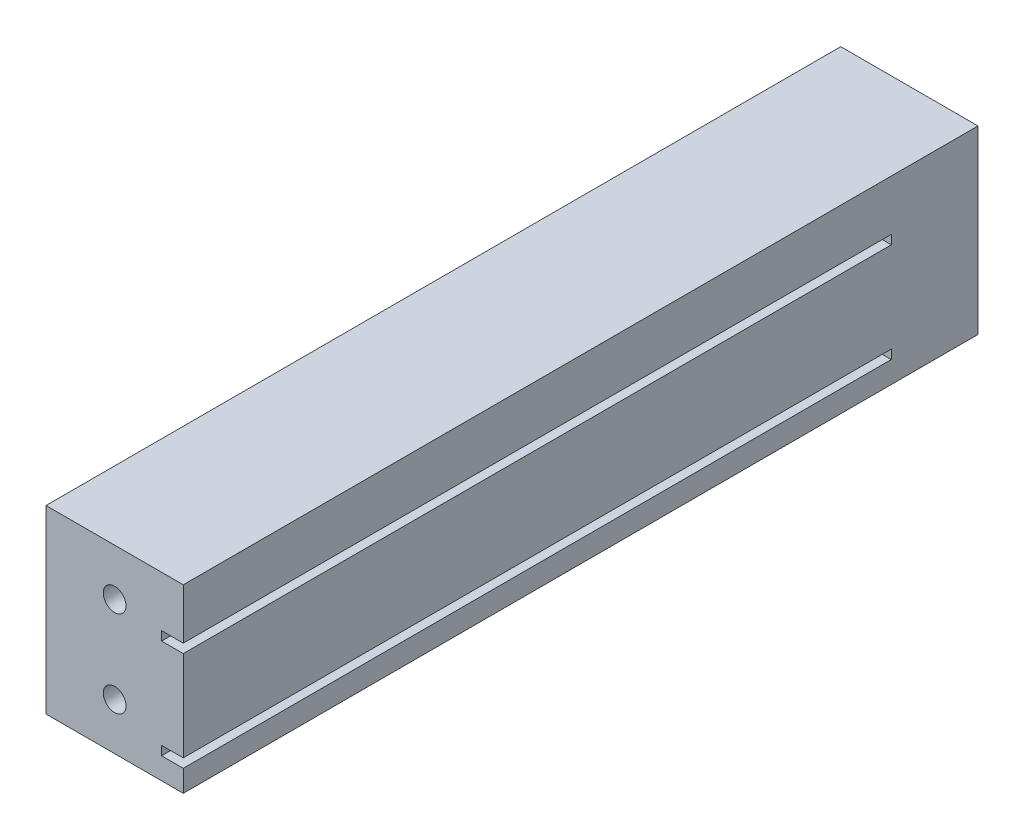
ISO-10303-21;
HEADER;
FILE_DESCRIPTION(('STEP AP214'),'2;1');
FILE_NAME('part.step','',(''),(''),'','','');
FILE_SCHEMA(('AUTOMOTIVE_DESIGN { 1 0 10303 214 1 1 1 1 }'));
ENDSEC;
DATA;
#1=APPLICATION_CONTEXT('core data for automotive mechanical design processes');
#2=APPLICATION_PROTOCOL_DEFINITION('international standard','automotive_design',2000,#1);
#3=PRODUCT_CONTEXT('',#1,'mechanical');
#4=PRODUCT('Part','Part','',(#3));
#5=PRODUCT_RELATED_PRODUCT_CATEGORY('part','',(#4));
#6=PRODUCT_DEFINITION_FORMATION('','',#4);
#7=PRODUCT_DEFINITION_CONTEXT('part definition',#1,'design');
#8=PRODUCT_DEFINITION('design','',#6,#7);
#9=PRODUCT_DEFINITION_SHAPE('','',#8);
#10=(LENGTH_UNIT() NAMED_UNIT(*) SI_UNIT(.MILLI.,.METRE.));
#11=(NAMED_UNIT(*) PLANE_ANGLE_UNIT() SI_UNIT($,.RADIAN.));
#12=(NAMED_UNIT(*) SI_UNIT($,.STERADIAN.) SOLID_ANGLE_UNIT());
#13=UNCERTAINTY_MEASURE_WITH_UNIT(LENGTH_MEASURE(1.E-05),#10,'distance_accuracy_value','');
#14=(GEOMETRIC_REPRESENTATION_CONTEXT(3) GLOBAL_UNCERTAINTY_ASSIGNED_CONTEXT((#13)) GLOBAL_UNIT_ASSIGNED_CONTEXT((#10,
#11,#12)) REPRESENTATION_CONTEXT('',''));
#15=CARTESIAN_POINT('',(0.,0.,0.));
#16=DIRECTION('',(0.,0.,1.));
#17=DIRECTION('',(1.,0.,0.));
#18=AXIS2_PLACEMENT_3D('',#15,#16,#17);
#19=CARTESIAN_POINT('',(-9.5,25.,55.));
#20=DIRECTION('',(1.,0.,0.));
#21=DIRECTION('',(0.,0.,-1.));
#22=AXIS2_PLACEMENT_3D('',#19,#20,#21);
#23=PLANE('',#22);
#24=CARTESIAN_POINT('',(-9.5,6.,51.));
#25=DIRECTION('',(-1.,0.,0.));
#26=DIRECTION('',(0.,0.,1.));
#27=AXIS2_PLACEMENT_3D('',#24,#25,#26);
#28=CIRCLE('',#27,1.5);
#29=CARTESIAN_POINT('',(-9.5,6.,52.5));
#30=VERTEX_POINT('',#29);
#31=EDGE_CURVE('E144',#30,#30,#28,.T.);
#32=ORIENTED_EDGE('',*,*,#31,.F.);
#33=EDGE_LOOP('',(#32));
#34=FACE_BOUND('',#33,.T.);
#35=CARTESIAN_POINT('',(-9.5,6.,-50.));
#36=DIRECTION('',(-1.,0.,0.));
#37=DIRECTION('',(0.,0.,1.));
#38=AXIS2_PLACEMENT_3D('',#35,#36,#37);
#39=CIRCLE('',#38,1.5);
#40=CARTESIAN_POINT('',(-9.5,6.,-48.5));
#41=VERTEX_POINT('',#40);
#42=EDGE_CURVE('E143',#41,#41,#39,.T.);
#43=ORIENTED_EDGE('',*,*,#42,.F.);
#44=EDGE_LOOP('',(#43));
#45=FACE_BOUND('',#44,.T.);
#46=DIRECTION('',(0.,0.,1.));
#47=VECTOR('',#46,1.);
#48=CARTESIAN_POINT('',(-9.5,0.,55.));
#49=LINE('',#48,#47);
#50=CARTESIAN_POINT('',(-9.5,0.,-55.));
#51=VERTEX_POINT('',#50);
#52=CARTESIAN_POINT('',(-9.5,0.,55.));
#53=VERTEX_POINT('',#52);
#54=EDGE_CURVE('E209',#51,#53,#49,.T.);
#55=ORIENTED_EDGE('',*,*,#54,.T.);
#56=DIRECTION('',(0.,-1.,0.));
#57=VECTOR('',#56,1.);
#58=CARTESIAN_POINT('',(-9.5,25.,55.));
#59=LINE('',#58,#57);
#60=CARTESIAN_POINT('',(-9.5,25.,55.));
#61=VERTEX_POINT('',#60);
#62=EDGE_CURVE('E47',#61,#53,#59,.T.);
#63=ORIENTED_EDGE('',*,*,#62,.F.);
#64=DIRECTION('',(0.,0.,1.));
#65=VECTOR('',#64,1.);
#66=CARTESIAN_POINT('',(-9.5,25.,55.));
#67=LINE('',#66,#65);
#68=CARTESIAN_POINT('',(-9.5,25.,-55.));
#69=VERTEX_POINT('',#68);
#70=EDGE_CURVE('E215',#69,#61,#67,.T.);
#71=ORIENTED_EDGE('',*,*,#70,.F.);
#72=DIRECTION('',(0.,-1.,0.));
#73=VECTOR('',#72,1.);
#74=CARTESIAN_POINT('',(-9.5,25.,-55.));
#75=LINE('',#74,#73);
#76=EDGE_CURVE('E225',#69,#51,#75,.T.);
#77=ORIENTED_EDGE('',*,*,#76,.T.);
#78=EDGE_LOOP('',(#55,#63,#71,#77));
#79=FACE_BOUND('',#78,.T.);
#80=ADVANCED_FACE('F35',(#34,#45,#79),#23,.F.);
#81=CARTESIAN_POINT('',(9.5,25.,55.));
#82=DIRECTION('',(0.,0.,-1.));
#83=DIRECTION('',(-1.,0.,0.));
#84=AXIS2_PLACEMENT_3D('',#81,#82,#83);
#85=PLANE('',#84);
#86=CARTESIAN_POINT('',(0.,6.5,55.));
#87=DIRECTION('',(0.,0.,1.));
#88=DIRECTION('',(-1.,0.,0.));
#89=AXIS2_PLACEMENT_3D('',#86,#87,#88);
#90=CIRCLE('',#89,1.575);
#91=CARTESIAN_POINT('',(-1.575,6.5,55.));
#92=VERTEX_POINT('',#91);
#93=EDGE_CURVE('E482',#92,#92,#90,.T.);
#94=ORIENTED_EDGE('',*,*,#93,.F.);
#95=EDGE_LOOP('',(#94));
#96=FACE_BOUND('',#95,.T.);
#97=CARTESIAN_POINT('',(0.,18.5,55.));
#98=DIRECTION('',(0.,0.,1.));
#99=DIRECTION('',(1.,0.,0.));
#100=AXIS2_PLACEMENT_3D('',#97,#98,#99);
#101=CIRCLE('',#100,1.575);
#102=CARTESIAN_POINT('',(1.575,18.5,55.));
#103=VERTEX_POINT('',#102);
#104=EDGE_CURVE('E139',#103,#103,#101,.T.);
#105=ORIENTED_EDGE('',*,*,#104,.F.);
#106=EDGE_LOOP('',(#105));
#107=FACE_BOUND('',#106,.T.);
#108=DIRECTION('',(0.,-1.,0.));
#109=VECTOR('',#108,1.);
#110=CARTESIAN_POINT('',(6.5,18.,55.));
#111=LINE('',#110,#109);
#112=CARTESIAN_POINT('',(6.5,18.,55.));
#113=VERTEX_POINT('',#112);
#114=CARTESIAN_POINT('',(6.5,16.75,55.));
#115=VERTEX_POINT('',#114);
#116=EDGE_CURVE('E158',#113,#115,#111,.T.);
#117=ORIENTED_EDGE('',*,*,#116,.F.);
#118=DIRECTION('',(1.,0.,0.));
#119=VECTOR('',#118,1.);
#120=CARTESIAN_POINT('',(6.5,18.,55.));
#121=LINE('',#120,#119);
#122=CARTESIAN_POINT('',(9.5,18.,55.));
#123=VERTEX_POINT('',#122);
#124=EDGE_CURVE('E176',#113,#123,#121,.T.);
#125=ORIENTED_EDGE('',*,*,#124,.T.);
#126=DIRECTION('',(0.,-1.,0.));
#127=VECTOR('',#126,1.);
#128=CARTESIAN_POINT('',(9.5,25.,55.));
#129=LINE('',#128,#127);
#130=CARTESIAN_POINT('',(9.5,25.,55.));
#131=VERTEX_POINT('',#130);
#132=EDGE_CURVE('E240',#131,#123,#129,.T.);
#133=ORIENTED_EDGE('',*,*,#132,.F.);
#134=DIRECTION('',(1.,0.,0.));
#135=VECTOR('',#134,1.);
#136=CARTESIAN_POINT('',(9.5,25.,55.));
#137=LINE('',#136,#135);
#138=EDGE_CURVE('E218',#61,#131,#137,.T.);
#139=ORIENTED_EDGE('',*,*,#138,.F.);
#140=ORIENTED_EDGE('',*,*,#62,.T.);
#141=DIRECTION('',(1.,0.,0.));
#142=VECTOR('',#141,1.);
#143=CARTESIAN_POINT('',(9.5,0.,55.));
#144=LINE('',#143,#142);
#145=CARTESIAN_POINT('',(9.5,0.,55.));
#146=VERTEX_POINT('',#145);
#147=EDGE_CURVE('E228',#53,#146,#144,.T.);
#148=ORIENTED_EDGE('',*,*,#147,.T.);
#149=CARTESIAN_POINT('',(9.5,3.,55.));
#150=VERTEX_POINT('',#149);
#151=EDGE_CURVE('E239',#150,#146,#129,.T.);
#152=ORIENTED_EDGE('',*,*,#151,.F.);
#153=DIRECTION('',(1.,0.,0.));
#154=VECTOR('',#153,1.);
#155=CARTESIAN_POINT('',(6.5,3.,55.));
#156=LINE('',#155,#154);
#157=CARTESIAN_POINT('',(6.5,3.,55.));
#158=VERTEX_POINT('',#157);
#159=EDGE_CURVE('E198',#158,#150,#156,.T.);
#160=ORIENTED_EDGE('',*,*,#159,.F.);
#161=DIRECTION('',(0.,-1.,0.));
#162=VECTOR('',#161,1.);
#163=CARTESIAN_POINT('',(6.5,4.25,55.));
#164=LINE('',#163,#162);
#165=CARTESIAN_POINT('',(6.5,4.25,55.));
#166=VERTEX_POINT('',#165);
#167=EDGE_CURVE('E185',#166,#158,#164,.T.);
#168=ORIENTED_EDGE('',*,*,#167,.F.);
#169=DIRECTION('',(1.,0.,0.));
#170=VECTOR('',#169,1.);
#171=CARTESIAN_POINT('',(6.5,4.25,55.));
#172=LINE('',#171,#170);
#173=CARTESIAN_POINT('',(9.5,4.25,55.));
#174=VERTEX_POINT('',#173);
#175=EDGE_CURVE('E206',#166,#174,#172,.T.);
#176=ORIENTED_EDGE('',*,*,#175,.T.);
#177=CARTESIAN_POINT('',(9.5,16.75,55.));
#178=VERTEX_POINT('',#177);
#179=EDGE_CURVE('E242',#178,#174,#129,.T.);
#180=ORIENTED_EDGE('',*,*,#179,.F.);
#181=DIRECTION('',(1.,0.,0.));
#182=VECTOR('',#181,1.);
#183=CARTESIAN_POINT('',(6.5,16.75,55.));
#184=LINE('',#183,#182);
#185=EDGE_CURVE('E60',#115,#178,#184,.T.);
#186=ORIENTED_EDGE('',*,*,#185,.F.);
#187=EDGE_LOOP('',(#117,#125,#133,#139,#140,#148,#152,#160,#168,#176,#180,#186));
#188=FACE_BOUND('',#187,.T.);
#189=ADVANCED_FACE('F247',(#96,#107,#188),#85,.F.);
#190=CARTESIAN_POINT('',(9.5,25.,55.));
#191=DIRECTION('',(-1.,0.,0.));
#192=DIRECTION('',(0.,0.,1.));
#193=AXIS2_PLACEMENT_3D('',#190,#191,#192);
#194=PLANE('',#193);
#195=ORIENTED_EDGE('',*,*,#132,.T.);
#196=DIRECTION('',(0.,0.,1.));
#197=VECTOR('',#196,1.);
#198=CARTESIAN_POINT('',(9.5,18.,55.));
#199=LINE('',#198,#197);
#200=CARTESIAN_POINT('',(9.5,18.,-43.));
#201=VERTEX_POINT('',#200);
#202=EDGE_CURVE('E162',#201,#123,#199,.T.);
#203=ORIENTED_EDGE('',*,*,#202,.F.);
#204=DIRECTION('',(0.,1.,0.));
#205=VECTOR('',#204,1.);
#206=CARTESIAN_POINT('',(9.5,18.,-43.));
#207=LINE('',#206,#205);
#208=CARTESIAN_POINT('',(9.5,16.75,-43.));
#209=VERTEX_POINT('',#208);
#210=EDGE_CURVE('E172',#209,#201,#207,.T.);
#211=ORIENTED_EDGE('',*,*,#210,.F.);
#212=DIRECTION('',(0.,0.,-1.));
#213=VECTOR('',#212,1.);
#214=CARTESIAN_POINT('',(9.5,16.75,55.));
#215=LINE('',#214,#213);
#216=EDGE_CURVE('E156',#178,#209,#215,.T.);
#217=ORIENTED_EDGE('',*,*,#216,.F.);
#218=ORIENTED_EDGE('',*,*,#179,.T.);
#219=DIRECTION('',(0.,0.,1.));
#220=VECTOR('',#219,1.);
#221=CARTESIAN_POINT('',(9.5,4.25,55.));
#222=LINE('',#221,#220);
#223=CARTESIAN_POINT('',(9.5,4.25,-43.));
#224=VERTEX_POINT('',#223);
#225=EDGE_CURVE('E189',#224,#174,#222,.T.);
#226=ORIENTED_EDGE('',*,*,#225,.F.);
#227=DIRECTION('',(0.,1.,0.));
#228=VECTOR('',#227,1.);
#229=CARTESIAN_POINT('',(9.5,4.25,-43.));
#230=LINE('',#229,#228);
#231=CARTESIAN_POINT('',(9.5,3.,-43.));
#232=VERTEX_POINT('',#231);
#233=EDGE_CURVE('E201',#232,#224,#230,.T.);
#234=ORIENTED_EDGE('',*,*,#233,.F.);
#235=DIRECTION('',(0.,0.,-1.));
#236=VECTOR('',#235,1.);
#237=CARTESIAN_POINT('',(9.5,3.,55.));
#238=LINE('',#237,#236);
#239=EDGE_CURVE('E179',#150,#232,#238,.T.);
#240=ORIENTED_EDGE('',*,*,#239,.F.);
#241=ORIENTED_EDGE('',*,*,#151,.T.);
#242=DIRECTION('',(0.,0.,-1.));
#243=VECTOR('',#242,1.);
#244=CARTESIAN_POINT('',(9.5,0.,55.));
#245=LINE('',#244,#243);
#246=CARTESIAN_POINT('',(9.5,0.,-55.));
#247=VERTEX_POINT('',#246);
#248=EDGE_CURVE('E231',#146,#247,#245,.T.);
#249=ORIENTED_EDGE('',*,*,#248,.T.);
#250=DIRECTION('',(0.,-1.,0.));
#251=VECTOR('',#250,1.);
#252=CARTESIAN_POINT('',(9.5,25.,-55.));
#253=LINE('',#252,#251);
#254=CARTESIAN_POINT('',(9.5,25.,-55.));
#255=VERTEX_POINT('',#254);
#256=EDGE_CURVE('E236',#255,#247,#253,.T.);
#257=ORIENTED_EDGE('',*,*,#256,.F.);
#258=DIRECTION('',(0.,0.,-1.));
#259=VECTOR('',#258,1.);
#260=CARTESIAN_POINT('',(9.5,25.,55.));
#261=LINE('',#260,#259);
#262=EDGE_CURVE('E221',#131,#255,#261,.T.);
#263=ORIENTED_EDGE('',*,*,#262,.F.);
#264=EDGE_LOOP('',(#195,#203,#211,#217,#218,#226,#234,#240,#241,#249,#257,#263));
#265=FACE_BOUND('',#264,.T.);
#266=ADVANCED_FACE('F260',(#265),#194,.F.);
#267=CARTESIAN_POINT('',(9.5,25.,-55.));
#268=DIRECTION('',(0.,0.,1.));
#269=DIRECTION('',(1.,0.,0.));
#270=AXIS2_PLACEMENT_3D('',#267,#268,#269);
#271=PLANE('',#270);
#272=DIRECTION('',(-1.,0.,0.));
#273=VECTOR('',#272,1.);
#274=CARTESIAN_POINT('',(9.5,0.,-55.));
#275=LINE('',#274,#273);
#276=EDGE_CURVE('E219',#247,#51,#275,.T.);
#277=ORIENTED_EDGE('',*,*,#276,.T.);
#278=ORIENTED_EDGE('',*,*,#76,.F.);
#279=DIRECTION('',(-1.,0.,0.));
#280=VECTOR('',#279,1.);
#281=CARTESIAN_POINT('',(9.5,25.,-55.));
#282=LINE('',#281,#280);
#283=EDGE_CURVE('E223',#255,#69,#282,.T.);
#284=ORIENTED_EDGE('',*,*,#283,.F.);
#285=ORIENTED_EDGE('',*,*,#256,.T.);
#286=EDGE_LOOP('',(#277,#278,#284,#285));
#287=FACE_BOUND('',#286,.T.);
#288=ADVANCED_FACE('F265',(#287),#271,.F.);
#289=CARTESIAN_POINT('',(0.,25.,0.));
#290=DIRECTION('',(0.,1.,0.));
#291=DIRECTION('',(0.,0.,1.));
#292=AXIS2_PLACEMENT_3D('',#289,#290,#291);
#293=PLANE('',#292);
#294=ORIENTED_EDGE('',*,*,#70,.T.);
#295=ORIENTED_EDGE('',*,*,#138,.T.);
#296=ORIENTED_EDGE('',*,*,#262,.T.);
#297=ORIENTED_EDGE('',*,*,#283,.T.);
#298=EDGE_LOOP('',(#294,#295,#296,#297));
#299=FACE_BOUND('',#298,.T.);
#300=ADVANCED_FACE('F267',(#299),#293,.T.);
#301=CARTESIAN_POINT('',(0.,0.,0.));
#302=DIRECTION('',(0.,1.,0.));
#303=DIRECTION('',(0.,0.,1.));
#304=AXIS2_PLACEMENT_3D('',#301,#302,#303);
#305=PLANE('',#304);
#306=ORIENTED_EDGE('',*,*,#54,.F.);
#307=ORIENTED_EDGE('',*,*,#276,.F.);
#308=ORIENTED_EDGE('',*,*,#248,.F.);
#309=ORIENTED_EDGE('',*,*,#147,.F.);
#310=EDGE_LOOP('',(#306,#307,#308,#309));
#311=FACE_BOUND('',#310,.T.);
#312=ADVANCED_FACE('F257',(#311),#305,.F.);
#313=CARTESIAN_POINT('',(6.5,4.25,55.));
#314=DIRECTION('',(0.,1.,0.));
#315=DIRECTION('',(0.,0.,1.));
#316=AXIS2_PLACEMENT_3D('',#313,#314,#315);
#317=PLANE('',#316);
#318=ORIENTED_EDGE('',*,*,#225,.T.);
#319=ORIENTED_EDGE('',*,*,#175,.F.);
#320=DIRECTION('',(0.,0.,1.));
#321=VECTOR('',#320,1.);
#322=CARTESIAN_POINT('',(6.5,4.25,55.));
#323=LINE('',#322,#321);
#324=CARTESIAN_POINT('',(6.5,4.25,-43.));
#325=VERTEX_POINT('',#324);
#326=EDGE_CURVE('E195',#325,#166,#323,.T.);
#327=ORIENTED_EDGE('',*,*,#326,.F.);
#328=DIRECTION('',(1.,0.,0.));
#329=VECTOR('',#328,1.);
#330=CARTESIAN_POINT('',(6.5,4.25,-43.));
#331=LINE('',#330,#329);
#332=EDGE_CURVE('E210',#325,#224,#331,.T.);
#333=ORIENTED_EDGE('',*,*,#332,.T.);
#334=EDGE_LOOP('',(#318,#319,#327,#333));
#335=FACE_BOUND('',#334,.T.);
#336=ADVANCED_FACE('F284',(#335),#317,.F.);
#337=CARTESIAN_POINT('',(6.5,4.25,-43.));
#338=DIRECTION('',(0.,0.,-1.));
#339=DIRECTION('',(-1.,0.,0.));
#340=AXIS2_PLACEMENT_3D('',#337,#338,#339);
#341=PLANE('',#340);
#342=ORIENTED_EDGE('',*,*,#233,.T.);
#343=ORIENTED_EDGE('',*,*,#332,.F.);
#344=DIRECTION('',(0.,1.,0.));
#345=VECTOR('',#344,1.);
#346=CARTESIAN_POINT('',(6.5,4.25,-43.));
#347=LINE('',#346,#345);
#348=CARTESIAN_POINT('',(6.5,3.,-43.));
#349=VERTEX_POINT('',#348);
#350=EDGE_CURVE('E192',#349,#325,#347,.T.);
#351=ORIENTED_EDGE('',*,*,#350,.F.);
#352=DIRECTION('',(1.,0.,0.));
#353=VECTOR('',#352,1.);
#354=CARTESIAN_POINT('',(6.5,3.,-43.));
#355=LINE('',#354,#353);
#356=EDGE_CURVE('E212',#349,#232,#355,.T.);
#357=ORIENTED_EDGE('',*,*,#356,.T.);
#358=EDGE_LOOP('',(#342,#343,#351,#357));
#359=FACE_BOUND('',#358,.T.);
#360=ADVANCED_FACE('F289',(#359),#341,.F.);
#361=CARTESIAN_POINT('',(6.5,3.,55.));
#362=DIRECTION('',(0.,-1.,0.));
#363=DIRECTION('',(0.,0.,-1.));
#364=AXIS2_PLACEMENT_3D('',#361,#362,#363);
#365=PLANE('',#364);
#366=ORIENTED_EDGE('',*,*,#239,.T.);
#367=ORIENTED_EDGE('',*,*,#356,.F.);
#368=DIRECTION('',(0.,0.,-1.));
#369=VECTOR('',#368,1.);
#370=CARTESIAN_POINT('',(6.5,3.,55.));
#371=LINE('',#370,#369);
#372=EDGE_CURVE('E188',#158,#349,#371,.T.);
#373=ORIENTED_EDGE('',*,*,#372,.F.);
#374=ORIENTED_EDGE('',*,*,#159,.T.);
#375=EDGE_LOOP('',(#366,#367,#373,#374));
#376=FACE_BOUND('',#375,.T.);
#377=ADVANCED_FACE('F292',(#376),#365,.F.);
#378=CARTESIAN_POINT('',(6.5,0.,0.));
#379=DIRECTION('',(1.,0.,0.));
#380=DIRECTION('',(0.,0.,-1.));
#381=AXIS2_PLACEMENT_3D('',#378,#379,#380);
#382=PLANE('',#381);
#383=ORIENTED_EDGE('',*,*,#167,.T.);
#384=ORIENTED_EDGE('',*,*,#372,.T.);
#385=ORIENTED_EDGE('',*,*,#350,.T.);
#386=ORIENTED_EDGE('',*,*,#326,.T.);
#387=EDGE_LOOP('',(#383,#384,#385,#386));
#388=FACE_BOUND('',#387,.T.);
#389=ADVANCED_FACE('F286',(#388),#382,.T.);
#390=CARTESIAN_POINT('',(6.5,18.,55.));
#391=DIRECTION('',(0.,1.,0.));
#392=DIRECTION('',(0.,0.,1.));
#393=AXIS2_PLACEMENT_3D('',#390,#391,#392);
#394=PLANE('',#393);
#395=ORIENTED_EDGE('',*,*,#202,.T.);
#396=ORIENTED_EDGE('',*,*,#124,.F.);
#397=DIRECTION('',(0.,0.,1.));
#398=VECTOR('',#397,1.);
#399=CARTESIAN_POINT('',(6.5,18.,55.));
#400=LINE('',#399,#398);
#401=CARTESIAN_POINT('',(6.5,18.,-43.));
#402=VERTEX_POINT('',#401);
#403=EDGE_CURVE('E168',#402,#113,#400,.T.);
#404=ORIENTED_EDGE('',*,*,#403,.F.);
#405=DIRECTION('',(1.,0.,0.));
#406=VECTOR('',#405,1.);
#407=CARTESIAN_POINT('',(6.5,18.,-43.));
#408=LINE('',#407,#406);
#409=EDGE_CURVE('E180',#402,#201,#408,.T.);
#410=ORIENTED_EDGE('',*,*,#409,.T.);
#411=EDGE_LOOP('',(#395,#396,#404,#410));
#412=FACE_BOUND('',#411,.T.);
#413=ADVANCED_FACE('F272',(#412),#394,.F.);
#414=CARTESIAN_POINT('',(6.5,18.,-43.));
#415=DIRECTION('',(0.,0.,-1.));
#416=DIRECTION('',(-1.,0.,0.));
#417=AXIS2_PLACEMENT_3D('',#414,#415,#416);
#418=PLANE('',#417);
#419=ORIENTED_EDGE('',*,*,#210,.T.);
#420=ORIENTED_EDGE('',*,*,#409,.F.);
#421=DIRECTION('',(0.,1.,0.));
#422=VECTOR('',#421,1.);
#423=CARTESIAN_POINT('',(6.5,18.,-43.));
#424=LINE('',#423,#422);
#425=CARTESIAN_POINT('',(6.5,16.75,-43.));
#426=VERTEX_POINT('',#425);
#427=EDGE_CURVE('E165',#426,#402,#424,.T.);
#428=ORIENTED_EDGE('',*,*,#427,.F.);
#429=DIRECTION('',(1.,0.,0.));
#430=VECTOR('',#429,1.);
#431=CARTESIAN_POINT('',(6.5,16.75,-43.));
#432=LINE('',#431,#430);
#433=EDGE_CURVE('E182',#426,#209,#432,.T.);
#434=ORIENTED_EDGE('',*,*,#433,.T.);
#435=EDGE_LOOP('',(#419,#420,#428,#434));
#436=FACE_BOUND('',#435,.T.);
#437=ADVANCED_FACE('F277',(#436),#418,.F.);
#438=CARTESIAN_POINT('',(6.5,16.75,55.));
#439=DIRECTION('',(0.,-1.,0.));
#440=DIRECTION('',(0.,0.,-1.));
#441=AXIS2_PLACEMENT_3D('',#438,#439,#440);
#442=PLANE('',#441);
#443=ORIENTED_EDGE('',*,*,#216,.T.);
#444=ORIENTED_EDGE('',*,*,#433,.F.);
#445=DIRECTION('',(0.,0.,-1.));
#446=VECTOR('',#445,1.);
#447=CARTESIAN_POINT('',(6.5,16.75,55.));
#448=LINE('',#447,#446);
#449=EDGE_CURVE('E161',#115,#426,#448,.T.);
#450=ORIENTED_EDGE('',*,*,#449,.F.);
#451=ORIENTED_EDGE('',*,*,#185,.T.);
#452=EDGE_LOOP('',(#443,#444,#450,#451));
#453=FACE_BOUND('',#452,.T.);
#454=ADVANCED_FACE('F323',(#453),#442,.F.);
#455=CARTESIAN_POINT('',(6.5,0.,0.));
#456=DIRECTION('',(1.,0.,0.));
#457=DIRECTION('',(0.,0.,-1.));
#458=AXIS2_PLACEMENT_3D('',#455,#456,#457);
#459=PLANE('',#458);
#460=ORIENTED_EDGE('',*,*,#116,.T.);
#461=ORIENTED_EDGE('',*,*,#449,.T.);
#462=ORIENTED_EDGE('',*,*,#427,.T.);
#463=ORIENTED_EDGE('',*,*,#403,.T.);
#464=EDGE_LOOP('',(#460,#461,#462,#463));
#465=FACE_BOUND('',#464,.T.);
#466=ADVANCED_FACE('F274',(#465),#459,.T.);
#467=CARTESIAN_POINT('',(0.5,6.,-50.));
#468=DIRECTION('',(-1.,0.,0.));
#469=DIRECTION('',(0.,0.,1.));
#470=AXIS2_PLACEMENT_3D('',#467,#468,#469);
#471=CYLINDRICAL_SURFACE('',#470,1.5);
#472=CARTESIAN_POINT('',(0.5,6.,-50.));
#473=DIRECTION('',(-1.,0.,0.));
#474=DIRECTION('',(0.,0.,1.));
#475=AXIS2_PLACEMENT_3D('',#472,#473,#474);
#476=CIRCLE('',#475,1.5);
#477=CARTESIAN_POINT('',(0.5,6.,-48.5));
#478=VERTEX_POINT('',#477);
#479=EDGE_CURVE('E147',#478,#478,#476,.T.);
#480=ORIENTED_EDGE('',*,*,#479,.F.);
#481=EDGE_LOOP('',(#480));
#482=FACE_BOUND('',#481,.T.);
#483=ORIENTED_EDGE('',*,*,#42,.T.);
#484=EDGE_LOOP('',(#483));
#485=FACE_BOUND('',#484,.T.);
#486=ADVANCED_FACE('F312',(#482,#485),#471,.F.);
#487=CARTESIAN_POINT('',(0.5,6.,-50.));
#488=DIRECTION('',(-1.,0.,0.));
#489=DIRECTION('',(0.,0.,1.));
#490=AXIS2_PLACEMENT_3D('',#487,#488,#489);
#491=PLANE('',#490);
#492=ORIENTED_EDGE('',*,*,#479,.T.);
#493=EDGE_LOOP('',(#492));
#494=FACE_BOUND('',#493,.T.);
#495=ADVANCED_FACE('F314',(#494),#491,.T.);
#496=CARTESIAN_POINT('',(0.5,6.,51.));
#497=DIRECTION('',(-1.,0.,0.));
#498=DIRECTION('',(0.,0.,1.));
#499=AXIS2_PLACEMENT_3D('',#496,#497,#498);
#500=CYLINDRICAL_SURFACE('',#499,1.5);
#501=CARTESIAN_POINT('',(0.5,6.,51.));
#502=DIRECTION('',(-1.,0.,0.));
#503=DIRECTION('',(0.,0.,1.));
#504=AXIS2_PLACEMENT_3D('',#501,#502,#503);
#505=CIRCLE('',#504,1.5);
#506=CARTESIAN_POINT('',(0.5,5.10255573747064,49.7980874425928));
#507=VERTEX_POINT('',#506);
#508=CARTESIAN_POINT('',(0.5,5.05869876463996,52.1678835491226));
#509=VERTEX_POINT('',#508);
#510=EDGE_CURVE('E138',#507,#509,#505,.T.);
#511=ORIENTED_EDGE('',*,*,#510,.F.);
#512=CARTESIAN_POINT('',(0.5002,5.10262831749637,49.7980332519406));
#513=CARTESIAN_POINT('',(0.469801252137214,5.09159659360616,49.806269777566));
#514=CARTESIAN_POINT('',(0.438929284418992,5.08152327476734,49.8140260082759));
#515=CARTESIAN_POINT('',(0.376289791777142,5.06337541317052,49.8283058359672));
#516=CARTESIAN_POINT('',(0.344521347223774,5.05530301266987,49.8348281100761));
#517=CARTESIAN_POINT('',(0.248177841090172,5.0342714104095,49.8520863010183));
#518=CARTESIAN_POINT('',(0.18243987397653,5.02445205283101,49.860549474107));
#519=CARTESIAN_POINT('',(0.0492683237037966,5.01385712625378,49.8696996106478));
#520=CARTESIAN_POINT('',(-0.0181732788103043,5.01313835597361,49.8703377355173));
#521=CARTESIAN_POINT('',(-0.151999006032028,5.02093465641677,49.8635795004487));
#522=CARTESIAN_POINT('',(-0.218384258959907,5.02943909574575,49.8561923910077));
#523=CARTESIAN_POINT('',(-0.358359778629389,5.05704980969524,49.8332925768071));
#524=CARTESIAN_POINT('',(-0.431481240358482,5.07758947325443,49.816701965964));
#525=CARTESIAN_POINT('',(-0.572656815124803,5.12902684282095,49.7783500268974));
#526=CARTESIAN_POINT('',(-0.640695526226845,5.1599545852941,49.7565737584321));
#527=CARTESIAN_POINT('',(-0.772122443833957,5.23197939818583,49.710814077313));
#528=CARTESIAN_POINT('',(-0.835400236553225,5.27325538987531,49.6867970724983));
#529=CARTESIAN_POINT('',(-0.955208073199952,5.36512837656273,49.6400023656343));
#530=CARTESIAN_POINT('',(-1.01174547576432,5.41571505045477,49.6172233271362));
#531=CARTESIAN_POINT('',(-1.11396236520237,5.52244499002089,49.5769775481019));
#532=CARTESIAN_POINT('',(-1.16009367360474,5.57806147205068,49.5592716049479));
#533=CARTESIAN_POINT('',(-1.24442960557784,5.69648364335251,49.5297637414203));
#534=CARTESIAN_POINT('',(-1.28263670070767,5.75928708150343,49.5179599785334));
#535=CARTESIAN_POINT('',(-1.3500379605668,5.8913193803248,49.5024554215301));
#536=CARTESIAN_POINT('',(-1.37914575637012,5.96060215637844,49.4988303588571));
#537=CARTESIAN_POINT('',(-1.42658026314406,6.10254119983047,49.5018342201377));
#538=CARTESIAN_POINT('',(-1.44492044409894,6.17519312915597,49.5084502948551));
#539=CARTESIAN_POINT('',(-1.46853021438352,6.30932211642335,49.5309130689167));
#540=CARTESIAN_POINT('',(-1.47537863110471,6.370795713364,49.5451799600313));
#541=CARTESIAN_POINT('',(-1.48163532495224,6.4917810521847,49.5815011709464));
#542=CARTESIAN_POINT('',(-1.48104265477371,6.55129254330736,49.6035564819224));
#543=CARTESIAN_POINT('',(-1.4735008557818,6.66563144049424,49.6543463153861));
#544=CARTESIAN_POINT('',(-1.46666592006401,6.72052371265414,49.6829539525498));
#545=CARTESIAN_POINT('',(-1.44807180443294,6.82574586652671,49.7462387054002));
#546=CARTESIAN_POINT('',(-1.43631178147949,6.8760749653539,49.7809168596017));
#547=CARTESIAN_POINT('',(-1.40716017594519,6.9788481943554,49.8612565975007));
#548=CARTESIAN_POINT('',(-1.38918323468068,7.03044414255766,49.9077866782892));
#549=CARTESIAN_POINT('',(-1.35058174894238,7.12633265098076,50.0069522137547));
#550=CARTESIAN_POINT('',(-1.32995329576125,7.17061420399982,50.0595966706229));
#551=CARTESIAN_POINT('',(-1.28378397274894,7.26007808669341,50.1820099918236));
#552=CARTESIAN_POINT('',(-1.25812582126974,7.30347508980961,50.2530471948836));
#553=CARTESIAN_POINT('',(-1.21031207315204,7.37828416262527,50.4022716736326));
#554=CARTESIAN_POINT('',(-1.18815287333502,7.40970860927796,50.4804514612222));
#555=CARTESIAN_POINT('',(-1.15634930930324,7.45355278179541,50.6239339651652));
#556=CARTESIAN_POINT('',(-1.1449940889995,7.46869043340205,50.6880150492644));
#557=CARTESIAN_POINT('',(-1.12928289035721,7.49042391957333,50.8183835871048));
#558=CARTESIAN_POINT('',(-1.12491256755994,7.49703725458524,50.8846662329537));
#559=CARTESIAN_POINT('',(-1.12416710897885,7.50137520876599,51.0177493318944));
#560=CARTESIAN_POINT('',(-1.12781289454932,7.49907655646467,51.0845506854558));
#561=CARTESIAN_POINT('',(-1.1424900124786,7.48577979180251,51.2165018479682));
#562=CARTESIAN_POINT('',(-1.15353403527999,7.47476672542489,51.2816486191254));
#563=CARTESIAN_POINT('',(-1.18454285077591,7.44097136555715,51.424564015946));
#564=CARTESIAN_POINT('',(-1.20604030245671,7.41594845789188,51.5014585909884));
#565=CARTESIAN_POINT('',(-1.2533735136501,7.35460964309968,51.6491968243576));
#566=CARTESIAN_POINT('',(-1.27921717349402,7.31827306622125,51.720029102602));
#567=CARTESIAN_POINT('',(-1.3320295857637,7.23417017700569,51.8563706378062));
#568=CARTESIAN_POINT('',(-1.35901056759637,7.18617998441263,51.921736974612));
#569=CARTESIAN_POINT('',(-1.41005561220375,7.07965864905251,52.0444713889582));
#570=CARTESIAN_POINT('',(-1.43412378304514,7.02114264807083,52.1018507484622));
#571=CARTESIAN_POINT('',(-1.472447478931,6.90490851323248,52.1982629164751));
#572=CARTESIAN_POINT('',(-1.48767419739292,6.84872984808476,52.238757311435));
#573=CARTESIAN_POINT('',(-1.51183440313949,6.73029163296895,52.3120643552315));
#574=CARTESIAN_POINT('',(-1.5207718223989,6.66803591006062,52.3448817950009));
#575=CARTESIAN_POINT('',(-1.53055585299663,6.53841273969261,52.4018402256301));
#576=CARTESIAN_POINT('',(-1.53133785033284,6.47100872538636,52.4259104693251));
#577=CARTESIAN_POINT('',(-1.52324859101415,6.3339932369296,52.4640673605245));
#578=CARTESIAN_POINT('',(-1.51438474972653,6.2643834983746,52.478161663428));
#579=CARTESIAN_POINT('',(-1.4883767055284,6.13483848135833,52.4951696051719));
#580=CARTESIAN_POINT('',(-1.47244413197813,6.07481041458662,52.4992881187536));
#581=CARTESIAN_POINT('',(-1.43326239471263,5.9571328544764,52.5005418145837));
#582=CARTESIAN_POINT('',(-1.41001222545196,5.89948368926623,52.4976760367225));
#583=CARTESIAN_POINT('',(-1.35657354651498,5.78730139930406,52.4859286652299));
#584=CARTESIAN_POINT('',(-1.32630176925587,5.73281635549968,52.4769721616169));
#585=CARTESIAN_POINT('',(-1.25986310341548,5.62868249668077,52.4542931436037));
#586=CARTESIAN_POINT('',(-1.22369382351761,5.57903565655991,52.4405686933357));
#587=CARTESIAN_POINT('',(-1.12961826531988,5.46490229038754,52.4030896460729));
#588=CARTESIAN_POINT('',(-1.06904454924041,5.40318988902209,52.3775581850825));
#589=CARTESIAN_POINT('',(-0.939074485532392,5.2912085099408,52.3234424713597));
#590=CARTESIAN_POINT('',(-0.869651146152822,5.24097591319016,52.2948489236777));
#591=CARTESIAN_POINT('',(-0.722052834977222,5.15193339235596,52.2383821634949));
#592=CARTESIAN_POINT('',(-0.643768656777387,5.11329377909899,52.2105247050096));
#593=CARTESIAN_POINT('',(-0.480256230997025,5.04949170930069,52.1611082159777));
#594=CARTESIAN_POINT('',(-0.395061187366792,5.02426875262265,52.1395211139698));
#595=CARTESIAN_POINT('',(-0.243948331608082,4.99365790318215,52.1124617998853));
#596=CARTESIAN_POINT('',(-0.179264552749147,4.98470335891037,52.1041766879554));
#597=CARTESIAN_POINT('',(-0.0486306611871204,4.97507550572677,52.0952545417431));
#598=CARTESIAN_POINT('',(0.0173204199137947,4.97440880419841,52.0946236096736));
#599=CARTESIAN_POINT('',(0.118728560777749,4.97982684202281,52.0996568401932));
#600=CARTESIAN_POINT('',(0.154526311339127,4.98300279911718,52.1026107219716));
#601=CARTESIAN_POINT('',(0.225604433756262,4.99179405368684,52.1106565958705));
#602=CARTESIAN_POINT('',(0.260884504349487,4.99741071752623,52.1157497855716));
#603=CARTESIAN_POINT('',(0.33076147713339,5.01101201235843,52.1278232521016));
#604=CARTESIAN_POINT('',(0.36535593174491,5.01900390604521,52.1348093108458));
#605=CARTESIAN_POINT('',(0.433549592987961,5.03723096400298,52.1503115011951));
#606=CARTESIAN_POINT('',(0.467150058326397,5.04746314005956,52.1588255919236));
#607=CARTESIAN_POINT('',(0.500199999999996,5.05876714370946,52.1679386585945));
#608=B_SPLINE_CURVE_WITH_KNOTS('',3,(#512,#513,#514,#515,#516,#517,#518,#519,#520,#521,#522,
#523,#524,#525,#526,#527,#528,#529,#530,#531,#532,#533,#534,#535,#536,#537,#538,#539,#540,#541,
#542,#543,#544,#545,#546,#547,#548,#549,#550,#551,#552,#553,#554,#555,#556,#557,#558,#559,#560,
#561,#562,#563,#564,#565,#566,#567,#568,#569,#570,#571,#572,#573,#574,#575,#576,#577,#578,#579,
#580,#581,#582,#583,#584,#585,#586,#587,#588,#589,#590,#591,#592,#593,#594,#595,#596,#597,#598,
#599,#600,#601,#602,#603,#604,#605,#606,#607),.UNSPECIFIED.,.F.,.F.,(4,2,2,2,2,2,2,2,2,2,2,2,2,
2,2,2,2,2,2,2,2,2,2,2,2,2,2,2,2,2,2,2,2,2,2,2,2,2,2,2,2,2,2,2,2,2,2,4),(0.,0.100076606880788,
0.200259901130056,0.400218128499672,0.601423727320521,0.802397647059144,1.0343819336087,
1.26704284639701,1.5040434186108,1.74078283546931,1.9630892529458,2.18532622851535,
2.40961272718436,2.6336180485779,2.82309901573583,3.01260410545355,3.19871044013115,
3.38484864415012,3.59937655453311,3.81422441660086,4.07445264124568,4.3344111132465,
4.53404629089276,4.73327096068938,4.93301620681084,5.13310496295104,5.3827901487354,
5.63293420577952,5.88832826331305,6.14335782268494,6.35524665744043,6.56700290452827,
6.78043559722834,6.99370432653264,7.17954296105372,7.36540714369867,7.55359963357165,
7.74186862228202,8.0109273570936,8.28082730090745,8.55451736703187,8.82696258102571,
9.02358188884933,9.22035793902018,9.32840430251589,9.43651123094752,9.54495217753685,
9.65324935127265),.UNSPECIFIED.);
#609=EDGE_CURVE('E52',#507,#509,#608,.T.);
#610=ORIENTED_EDGE('',*,*,#609,.T.);
#611=EDGE_LOOP('',(#511,#610));
#612=FACE_BOUND('',#611,.T.);
#613=ORIENTED_EDGE('',*,*,#31,.T.);
#614=EDGE_LOOP('',(#613));
#615=FACE_BOUND('',#614,.T.);
#616=ADVANCED_FACE('F136',(#612,#615),#500,.F.);
#617=CARTESIAN_POINT('',(0.5,6.,51.));
#618=DIRECTION('',(-1.,0.,0.));
#619=DIRECTION('',(0.,0.,1.));
#620=AXIS2_PLACEMENT_3D('',#617,#618,#619);
#621=PLANE('',#620);
#622=CARTESIAN_POINT('',(0.5,5.15542226507795,46.9527379640053));
#623=CARTESIAN_POINT('',(0.5,5.13729947443751,47.9259120689865));
#624=CARTESIAN_POINT('',(0.5,5.11922029744683,48.8990869847411));
#625=CARTESIAN_POINT('',(0.5,5.08314110635719,50.8454382836646));
#626=CARTESIAN_POINT('',(0.5,5.06514109225821,51.8186146668335));
#627=CARTESIAN_POINT('',(0.5,5.00200496739078,55.2388460843841));
#628=CARTESIAN_POINT('',(0.5,4.95705807505508,57.6859046145391));
#629=CARTESIAN_POINT('',(0.5,4.91227184450555,60.132966072984));
#630=B_SPLINE_CURVE_WITH_KNOTS('',3,(#622,#623,#624,#625,#626,#627,#628,#629),.UNSPECIFIED.,.F.,
.F.,(4,2,2,4),(0.,2.92002850113347,5.84005700189318,13.1824707995242),.UNSPECIFIED.);
#631=EDGE_CURVE('E11',#507,#509,#630,.T.);
#632=ORIENTED_EDGE('',*,*,#631,.F.);
#633=ORIENTED_EDGE('',*,*,#510,.T.);
#634=EDGE_LOOP('',(#632,#633));
#635=FACE_BOUND('',#634,.T.);
#636=ADVANCED_FACE('F142',(#635),#621,.T.);
#637=CARTESIAN_POINT('',(0.,18.5,55.));
#638=DIRECTION('',(0.,0.,1.));
#639=DIRECTION('',(1.,0.,0.));
#640=AXIS2_PLACEMENT_3D('',#637,#638,#639);
#641=CONICAL_SURFACE('',#640,1.575,0.0174532925199433);
#642=CARTESIAN_POINT('',(0.,18.5,40.));
#643=DIRECTION('',(0.,0.,1.));
#644=DIRECTION('',(1.,0.,0.));
#645=AXIS2_PLACEMENT_3D('',#642,#643,#644);
#646=CIRCLE('',#645,1.31317402607674);
#647=CARTESIAN_POINT('',(1.31317402607674,18.5,40.));
#648=VERTEX_POINT('',#647);
#649=EDGE_CURVE('E150',#648,#648,#646,.T.);
#650=ORIENTED_EDGE('',*,*,#649,.F.);
#651=EDGE_LOOP('',(#650));
#652=FACE_BOUND('',#651,.T.);
#653=ORIENTED_EDGE('',*,*,#104,.T.);
#654=EDGE_LOOP('',(#653));
#655=FACE_BOUND('',#654,.T.);
#656=ADVANCED_FACE('F425',(#652,#655),#641,.F.);
#657=CARTESIAN_POINT('',(0.,18.5,40.));
#658=DIRECTION('',(0.,0.,1.));
#659=DIRECTION('',(1.,0.,0.));
#660=AXIS2_PLACEMENT_3D('',#657,#658,#659);
#661=PLANE('',#660);
#662=ORIENTED_EDGE('',*,*,#649,.T.);
#663=EDGE_LOOP('',(#662));
#664=FACE_BOUND('',#663,.T.);
#665=ADVANCED_FACE('F432',(#664),#661,.T.);
#666=CARTESIAN_POINT('',(0.,6.5,55.));
#667=DIRECTION('',(0.,0.,1.));
#668=DIRECTION('',(-1.,0.,0.));
#669=AXIS2_PLACEMENT_3D('',#666,#667,#668);
#670=CONICAL_SURFACE('',#669,1.575,0.0174532925199433);
#671=ORIENTED_EDGE('',*,*,#93,.T.);
#672=EDGE_LOOP('',(#671));
#673=FACE_BOUND('',#672,.T.);
#674=CARTESIAN_POINT('',(0.,6.5,40.));
#675=DIRECTION('',(0.,0.,-1.));
#676=DIRECTION('',(-1.,0.,0.));
#677=AXIS2_PLACEMENT_3D('',#674,#675,#676);
#678=CIRCLE('',#677,1.31317402607674);
#679=CARTESIAN_POINT('',(-1.31317402607674,6.5,40.));
#680=VERTEX_POINT('',#679);
#681=EDGE_CURVE('E140',#680,#680,#678,.F.);
#682=ORIENTED_EDGE('',*,*,#681,.F.);
#683=EDGE_LOOP('',(#682));
#684=FACE_BOUND('',#683,.T.);
#685=ORIENTED_EDGE('',*,*,#631,.T.);
#686=ORIENTED_EDGE('',*,*,#609,.F.);
#687=EDGE_LOOP('',(#685,#686));
#688=FACE_BOUND('',#687,.T.);
#689=ADVANCED_FACE('F131',(#673,#684,#688),#670,.F.);
#690=CARTESIAN_POINT('',(0.,6.5,40.));
#691=DIRECTION('',(0.,0.,-1.));
#692=DIRECTION('',(-1.,0.,0.));
#693=AXIS2_PLACEMENT_3D('',#690,#691,#692);
#694=PLANE('',#693);
#695=ORIENTED_EDGE('',*,*,#681,.T.);
#696=EDGE_LOOP('',(#695));
#697=FACE_BOUND('',#696,.T.);
#698=ADVANCED_FACE('F449',(#697),#694,.F.);
#699=CLOSED_SHELL('',(#80,#189,#266,#288,#300,#312,#336,#360,#377,#389,#413,#437,#454,#466,#486,
#495,#616,#636,#656,#665,#689,#698));
#700=MANIFOLD_SOLID_BREP('B2',#699);
#701=ADVANCED_BREP_SHAPE_REPRESENTATION('',(#18,#700),#14);
#702=SHAPE_DEFINITION_REPRESENTATION(#9,#701);
ENDSEC;
END-ISO-10303-21;
